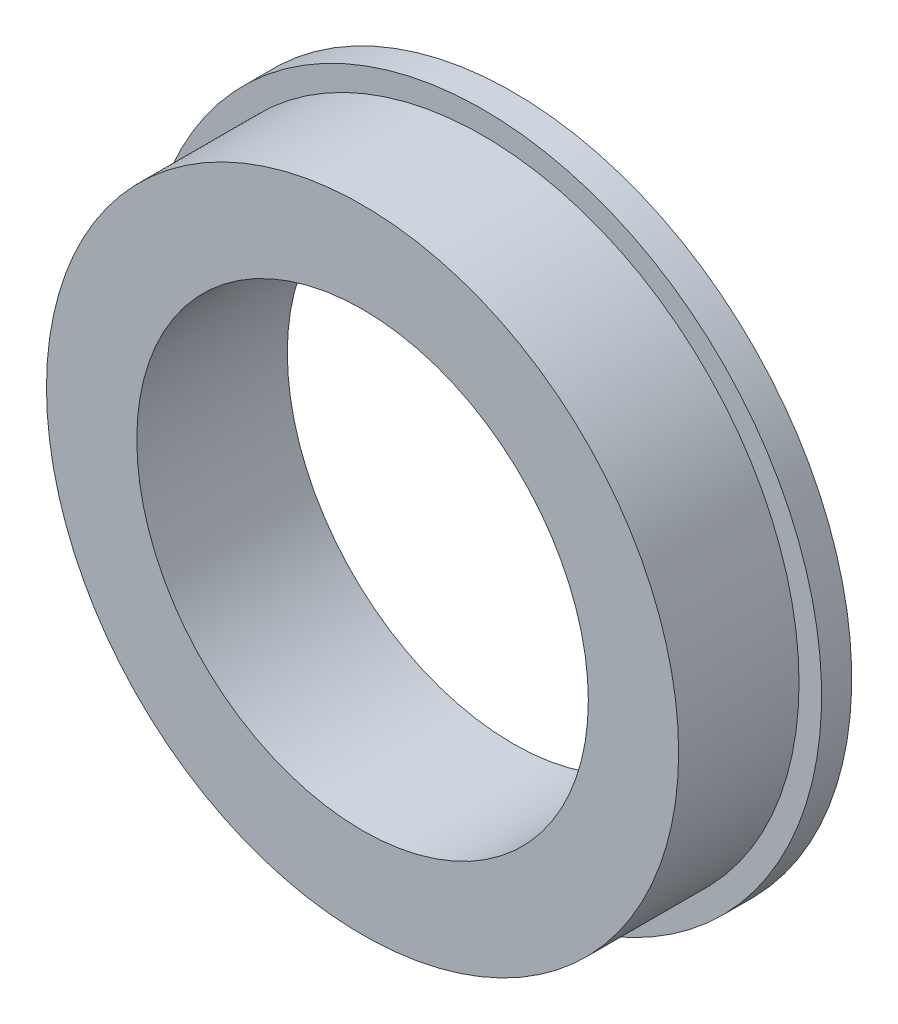
ISO-10303-21;
HEADER;
FILE_DESCRIPTION(('STEP AP214'),'2;1');
FILE_NAME('part.step','',(''),(''),'','','');
FILE_SCHEMA(('AUTOMOTIVE_DESIGN { 1 0 10303 214 1 1 1 1 }'));
ENDSEC;
DATA;
#1=APPLICATION_CONTEXT('core data for automotive mechanical design processes');
#2=APPLICATION_PROTOCOL_DEFINITION('international standard','automotive_design',2000,#1);
#3=PRODUCT_CONTEXT('',#1,'mechanical');
#4=PRODUCT('Part','Part','',(#3));
#5=PRODUCT_RELATED_PRODUCT_CATEGORY('part','',(#4));
#6=PRODUCT_DEFINITION_FORMATION('','',#4);
#7=PRODUCT_DEFINITION_CONTEXT('part definition',#1,'design');
#8=PRODUCT_DEFINITION('design','',#6,#7);
#9=PRODUCT_DEFINITION_SHAPE('','',#8);
#10=(LENGTH_UNIT() NAMED_UNIT(*) SI_UNIT(.MILLI.,.METRE.));
#11=(NAMED_UNIT(*) PLANE_ANGLE_UNIT() SI_UNIT($,.RADIAN.));
#12=(NAMED_UNIT(*) SI_UNIT($,.STERADIAN.) SOLID_ANGLE_UNIT());
#13=UNCERTAINTY_MEASURE_WITH_UNIT(LENGTH_MEASURE(1.E-05),#10,'distance_accuracy_value','');
#14=(GEOMETRIC_REPRESENTATION_CONTEXT(3) GLOBAL_UNCERTAINTY_ASSIGNED_CONTEXT((#13)) GLOBAL_UNIT_ASSIGNED_CONTEXT((#10,
#11,#12)) REPRESENTATION_CONTEXT('',''));
#15=CARTESIAN_POINT('',(0.,0.,0.));
#16=DIRECTION('',(0.,0.,1.));
#17=DIRECTION('',(1.,0.,0.));
#18=AXIS2_PLACEMENT_3D('',#15,#16,#17);
#19=CARTESIAN_POINT('',(0.,0.,10.));
#20=DIRECTION('',(0.,0.,-1.));
#21=DIRECTION('',(-1.,0.,0.));
#22=AXIS2_PLACEMENT_3D('',#19,#20,#21);
#23=CYLINDRICAL_SURFACE('',#22,15.);
#24=CARTESIAN_POINT('',(0.,0.,10.));
#25=DIRECTION('',(0.,0.,1.));
#26=DIRECTION('',(1.,0.,0.));
#27=AXIS2_PLACEMENT_3D('',#24,#25,#26);
#28=CIRCLE('',#27,15.);
#29=CARTESIAN_POINT('',(15.,0.,10.));
#30=VERTEX_POINT('',#29);
#31=EDGE_CURVE('E53',#30,#30,#28,.T.);
#32=ORIENTED_EDGE('',*,*,#31,.T.);
#33=EDGE_LOOP('',(#32));
#34=FACE_BOUND('',#33,.T.);
#35=CARTESIAN_POINT('',(0.,0.,0.));
#36=DIRECTION('',(0.,0.,1.));
#37=DIRECTION('',(1.,0.,0.));
#38=AXIS2_PLACEMENT_3D('',#35,#36,#37);
#39=CIRCLE('',#38,15.);
#40=CARTESIAN_POINT('',(15.,0.,0.));
#41=VERTEX_POINT('',#40);
#42=EDGE_CURVE('E65',#41,#41,#39,.T.);
#43=ORIENTED_EDGE('',*,*,#42,.F.);
#44=EDGE_LOOP('',(#43));
#45=FACE_BOUND('',#44,.T.);
#46=ADVANCED_FACE('F41',(#34,#45),#23,.F.);
#47=CARTESIAN_POINT('',(0.,0.,10.));
#48=DIRECTION('',(0.,0.,-1.));
#49=DIRECTION('',(-1.,0.,0.));
#50=AXIS2_PLACEMENT_3D('',#47,#48,#49);
#51=CYLINDRICAL_SURFACE('',#50,21.);
#52=CARTESIAN_POINT('',(0.,0.,10.));
#53=DIRECTION('',(0.,0.,1.));
#54=DIRECTION('',(1.,0.,0.));
#55=AXIS2_PLACEMENT_3D('',#52,#53,#54);
#56=CIRCLE('',#55,21.);
#57=CARTESIAN_POINT('',(21.,0.,10.));
#58=VERTEX_POINT('',#57);
#59=EDGE_CURVE('E48',#58,#58,#56,.T.);
#60=ORIENTED_EDGE('',*,*,#59,.F.);
#61=EDGE_LOOP('',(#60));
#62=FACE_BOUND('',#61,.T.);
#63=CARTESIAN_POINT('',(0.,0.,2.));
#64=DIRECTION('',(0.,0.,-1.));
#65=DIRECTION('',(-1.,0.,0.));
#66=AXIS2_PLACEMENT_3D('',#63,#64,#65);
#67=CIRCLE('',#66,21.);
#68=CARTESIAN_POINT('',(-21.,0.,2.));
#69=VERTEX_POINT('',#68);
#70=EDGE_CURVE('E10',#69,#69,#67,.T.);
#71=ORIENTED_EDGE('',*,*,#70,.F.);
#72=EDGE_LOOP('',(#71));
#73=FACE_BOUND('',#72,.T.);
#74=ADVANCED_FACE('F77',(#62,#73),#51,.T.);
#75=CARTESIAN_POINT('',(0.,0.,10.));
#76=DIRECTION('',(0.,0.,1.));
#77=DIRECTION('',(1.,0.,0.));
#78=AXIS2_PLACEMENT_3D('',#75,#76,#77);
#79=PLANE('',#78);
#80=ORIENTED_EDGE('',*,*,#31,.F.);
#81=EDGE_LOOP('',(#80));
#82=FACE_BOUND('',#81,.T.);
#83=ORIENTED_EDGE('',*,*,#59,.T.);
#84=EDGE_LOOP('',(#83));
#85=FACE_BOUND('',#84,.T.);
#86=ADVANCED_FACE('F82',(#82,#85),#79,.T.);
#87=CARTESIAN_POINT('',(0.,0.,2.));
#88=DIRECTION('',(0.,0.,-1.));
#89=DIRECTION('',(-1.,0.,0.));
#90=AXIS2_PLACEMENT_3D('',#87,#88,#89);
#91=PLANE('',#90);
#92=ORIENTED_EDGE('',*,*,#70,.T.);
#93=EDGE_LOOP('',(#92));
#94=FACE_BOUND('',#93,.T.);
#95=CARTESIAN_POINT('',(0.,0.,2.));
#96=DIRECTION('',(0.,0.,-1.));
#97=DIRECTION('',(-1.,0.,0.));
#98=AXIS2_PLACEMENT_3D('',#95,#96,#97);
#99=CIRCLE('',#98,22.5);
#100=CARTESIAN_POINT('',(-22.5,0.,2.));
#101=VERTEX_POINT('',#100);
#102=EDGE_CURVE('E58',#101,#101,#99,.T.);
#103=ORIENTED_EDGE('',*,*,#102,.F.);
#104=EDGE_LOOP('',(#103));
#105=FACE_BOUND('',#104,.T.);
#106=ADVANCED_FACE('F87',(#94,#105),#91,.F.);
#107=CARTESIAN_POINT('',(0.,0.,2.));
#108=DIRECTION('',(0.,0.,-1.));
#109=DIRECTION('',(-1.,0.,0.));
#110=AXIS2_PLACEMENT_3D('',#107,#108,#109);
#111=CYLINDRICAL_SURFACE('',#110,22.5);
#112=ORIENTED_EDGE('',*,*,#102,.T.);
#113=EDGE_LOOP('',(#112));
#114=FACE_BOUND('',#113,.T.);
#115=CARTESIAN_POINT('',(0.,0.,0.));
#116=DIRECTION('',(0.,0.,-1.));
#117=DIRECTION('',(-1.,0.,0.));
#118=AXIS2_PLACEMENT_3D('',#115,#116,#117);
#119=CIRCLE('',#118,22.5);
#120=CARTESIAN_POINT('',(-22.5,0.,0.));
#121=VERTEX_POINT('',#120);
#122=EDGE_CURVE('E61',#121,#121,#119,.T.);
#123=ORIENTED_EDGE('',*,*,#122,.F.);
#124=EDGE_LOOP('',(#123));
#125=FACE_BOUND('',#124,.T.);
#126=ADVANCED_FACE('F92',(#114,#125),#111,.T.);
#127=CARTESIAN_POINT('',(0.,0.,0.));
#128=DIRECTION('',(0.,0.,1.));
#129=DIRECTION('',(1.,0.,0.));
#130=AXIS2_PLACEMENT_3D('',#127,#128,#129);
#131=PLANE('',#130);
#132=ORIENTED_EDGE('',*,*,#42,.T.);
#133=EDGE_LOOP('',(#132));
#134=FACE_BOUND('',#133,.T.);
#135=ORIENTED_EDGE('',*,*,#122,.T.);
#136=EDGE_LOOP('',(#135));
#137=FACE_BOUND('',#136,.T.);
#138=ADVANCED_FACE('F73',(#134,#137),#131,.F.);
#139=CLOSED_SHELL('',(#46,#74,#86,#106,#126,#138));
#140=MANIFOLD_SOLID_BREP('B2',#139);
#141=ADVANCED_BREP_SHAPE_REPRESENTATION('',(#18,#140),#14);
#142=SHAPE_DEFINITION_REPRESENTATION(#9,#141);
ENDSEC;
END-ISO-10303-21;
